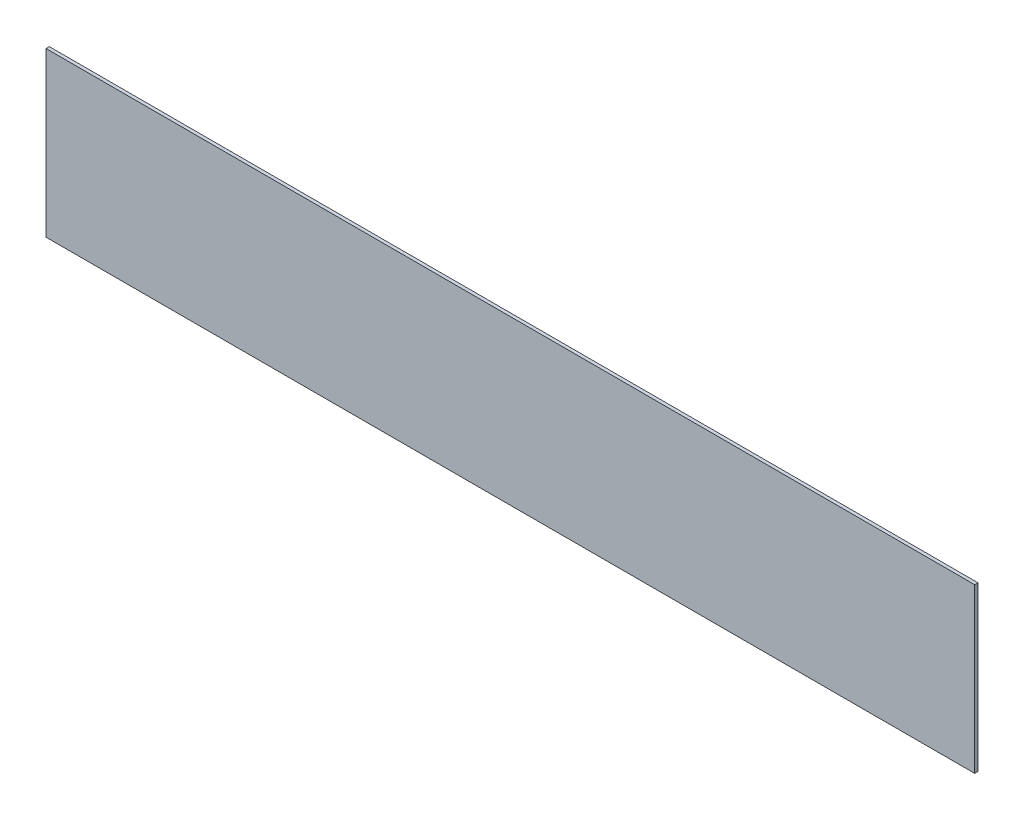
ISO-10303-21;
HEADER;
FILE_DESCRIPTION(('STEP AP214'),'2;1');
FILE_NAME('part.step','',(''),(''),'','','');
FILE_SCHEMA(('AUTOMOTIVE_DESIGN { 1 0 10303 214 1 1 1 1 }'));
ENDSEC;
DATA;
#1=APPLICATION_CONTEXT('core data for automotive mechanical design processes');
#2=APPLICATION_PROTOCOL_DEFINITION('international standard','automotive_design',2000,#1);
#3=PRODUCT_CONTEXT('',#1,'mechanical');
#4=PRODUCT('Part','Part','',(#3));
#5=PRODUCT_RELATED_PRODUCT_CATEGORY('part','',(#4));
#6=PRODUCT_DEFINITION_FORMATION('','',#4);
#7=PRODUCT_DEFINITION_CONTEXT('part definition',#1,'design');
#8=PRODUCT_DEFINITION('design','',#6,#7);
#9=PRODUCT_DEFINITION_SHAPE('','',#8);
#10=(LENGTH_UNIT() NAMED_UNIT(*) SI_UNIT(.MILLI.,.METRE.));
#11=(NAMED_UNIT(*) PLANE_ANGLE_UNIT() SI_UNIT($,.RADIAN.));
#12=(NAMED_UNIT(*) SI_UNIT($,.STERADIAN.) SOLID_ANGLE_UNIT());
#13=UNCERTAINTY_MEASURE_WITH_UNIT(LENGTH_MEASURE(1.E-05),#10,'distance_accuracy_value','');
#14=(GEOMETRIC_REPRESENTATION_CONTEXT(3) GLOBAL_UNCERTAINTY_ASSIGNED_CONTEXT((#13)) GLOBAL_UNIT_ASSIGNED_CONTEXT((#10,
#11,#12)) REPRESENTATION_CONTEXT('',''));
#15=CARTESIAN_POINT('',(0.,0.,0.));
#16=DIRECTION('',(0.,0.,1.));
#17=DIRECTION('',(1.,0.,0.));
#18=AXIS2_PLACEMENT_3D('',#15,#16,#17);
#19=CARTESIAN_POINT('',(22.200012096658,21.914673634277,1.345));
#20=DIRECTION('',(0.,0.,1.));
#21=DIRECTION('',(1.,0.,0.));
#22=AXIS2_PLACEMENT_3D('',#19,#20,#21);
#23=PLANE('',#22);
#24=DIRECTION('',(0.,1.,0.));
#25=VECTOR('',#24,1.);
#26=CARTESIAN_POINT('',(22.91034555136,21.914673634277,1.345));
#27=LINE('',#26,#25);
#28=CARTESIAN_POINT('',(22.91034555136,21.7896736342776,1.345));
#29=VERTEX_POINT('',#28);
#30=CARTESIAN_POINT('',(22.910345545896,22.039673665327,1.345));
#31=VERTEX_POINT('',#30);
#32=EDGE_CURVE('E20',#29,#31,#27,.T.);
#33=ORIENTED_EDGE('',*,*,#32,.F.);
#34=DIRECTION('',(0.999999999999999,4.371138828674E-08,0.));
#35=VECTOR('',#34,1.);
#36=CARTESIAN_POINT('',(21.489678652884,21.789673603228,1.345));
#37=LINE('',#36,#35);
#38=CARTESIAN_POINT('',(21.48967864742,21.789673603228,1.345));
#39=VERTEX_POINT('',#38);
#40=EDGE_CURVE('E55',#39,#29,#37,.T.);
#41=ORIENTED_EDGE('',*,*,#40,.F.);
#42=DIRECTION('',(4.371138828674E-08,-0.999999999999999,0.));
#43=VECTOR('',#42,1.);
#44=CARTESIAN_POINT('',(21.489678641956,22.039673603228,1.345));
#45=LINE('',#44,#43);
#46=CARTESIAN_POINT('',(21.489678641956,22.0396736342774,1.345));
#47=VERTEX_POINT('',#46);
#48=EDGE_CURVE('E58',#47,#39,#45,.T.);
#49=ORIENTED_EDGE('',*,*,#48,.F.);
#50=DIRECTION('',(-0.999999999999999,-4.371138828674E-08,0.));
#51=VECTOR('',#50,1.);
#52=CARTESIAN_POINT('',(22.910345540432,22.039673665327,1.345));
#53=LINE('',#52,#51);
#54=EDGE_CURVE('E60',#31,#47,#53,.T.);
#55=ORIENTED_EDGE('',*,*,#54,.F.);
#56=EDGE_LOOP('',(#33,#41,#49,#55));
#57=FACE_BOUND('',#56,.T.);
#58=ADVANCED_FACE('F17',(#57),#23,.F.);
#59=CARTESIAN_POINT('',(22.910345540432,22.039673665327,1.345));
#60=DIRECTION('',(-4.371138828674E-08,0.999999999999999,0.));
#61=DIRECTION('',(-0.999999999999999,-4.371138828674E-08,0.));
#62=AXIS2_PLACEMENT_3D('',#59,#60,#61);
#63=PLANE('',#62);
#64=DIRECTION('',(1.,0.,0.));
#65=VECTOR('',#64,1.);
#66=CARTESIAN_POINT('',(22.200012096658,22.039673665327,1.35));
#67=LINE('',#66,#65);
#68=CARTESIAN_POINT('',(22.910345543164,22.039673665327,1.35));
#69=VERTEX_POINT('',#68);
#70=CARTESIAN_POINT('',(21.489678641956,22.0396736187526,1.35));
#71=VERTEX_POINT('',#70);
#72=EDGE_CURVE('E83',#69,#71,#67,.F.);
#73=ORIENTED_EDGE('',*,*,#72,.F.);
#74=DIRECTION('',(0.,0.,1.));
#75=VECTOR('',#74,1.);
#76=CARTESIAN_POINT('',(22.9103455404322,22.039673665327,1.345));
#77=LINE('',#76,#75);
#78=EDGE_CURVE('E71',#31,#69,#77,.T.);
#79=ORIENTED_EDGE('',*,*,#78,.F.);
#80=ORIENTED_EDGE('',*,*,#54,.T.);
#81=DIRECTION('',(0.,0.,1.));
#82=VECTOR('',#81,1.);
#83=CARTESIAN_POINT('',(21.489678641956,22.039673603228,1.345));
#84=LINE('',#83,#82);
#85=EDGE_CURVE('E65',#71,#47,#84,.F.);
#86=ORIENTED_EDGE('',*,*,#85,.F.);
#87=EDGE_LOOP('',(#73,#79,#80,#86));
#88=FACE_BOUND('',#87,.T.);
#89=ADVANCED_FACE('F68',(#88),#63,.T.);
#90=CARTESIAN_POINT('',(21.489678641956,22.039673603228,1.345));
#91=DIRECTION('',(-0.999999999999999,-4.371138828674E-08,0.));
#92=DIRECTION('',(4.371138828674E-08,-0.999999999999999,0.));
#93=AXIS2_PLACEMENT_3D('',#90,#91,#92);
#94=PLANE('',#93);
#95=DIRECTION('',(0.,1.,0.));
#96=VECTOR('',#95,1.);
#97=CARTESIAN_POINT('',(21.489678641956,21.914673634277,1.35));
#98=LINE('',#97,#96);
#99=CARTESIAN_POINT('',(21.4896786501519,21.789673603228,1.35));
#100=VERTEX_POINT('',#99);
#101=EDGE_CURVE('E74',#71,#100,#98,.F.);
#102=ORIENTED_EDGE('',*,*,#101,.F.);
#103=ORIENTED_EDGE('',*,*,#85,.T.);
#104=ORIENTED_EDGE('',*,*,#48,.T.);
#105=DIRECTION('',(0.,0.,1.));
#106=VECTOR('',#105,1.);
#107=CARTESIAN_POINT('',(21.489678652884,21.789673603228,1.345));
#108=LINE('',#107,#106);
#109=EDGE_CURVE('E77',#100,#39,#108,.F.);
#110=ORIENTED_EDGE('',*,*,#109,.F.);
#111=EDGE_LOOP('',(#102,#103,#104,#110));
#112=FACE_BOUND('',#111,.T.);
#113=ADVANCED_FACE('F72',(#112),#94,.T.);
#114=CARTESIAN_POINT('',(21.489678652884,21.789673603228,1.345));
#115=DIRECTION('',(4.371138828674E-08,-0.999999999999999,0.));
#116=DIRECTION('',(0.999999999999999,4.371138828674E-08,0.));
#117=AXIS2_PLACEMENT_3D('',#114,#115,#116);
#118=PLANE('',#117);
#119=DIRECTION('',(1.,0.,0.));
#120=VECTOR('',#119,1.);
#121=CARTESIAN_POINT('',(22.200012096658,21.789673603228,1.35));
#122=LINE('',#121,#120);
#123=CARTESIAN_POINT('',(22.91034555136,21.7896736498024,1.35));
#124=VERTEX_POINT('',#123);
#125=EDGE_CURVE('E26',#100,#124,#122,.T.);
#126=ORIENTED_EDGE('',*,*,#125,.F.);
#127=ORIENTED_EDGE('',*,*,#109,.T.);
#128=ORIENTED_EDGE('',*,*,#40,.T.);
#129=DIRECTION('',(0.,0.,1.));
#130=VECTOR('',#129,1.);
#131=CARTESIAN_POINT('',(22.91034555136,21.789673665327,1.345));
#132=LINE('',#131,#130);
#133=EDGE_CURVE('E35',#124,#29,#132,.F.);
#134=ORIENTED_EDGE('',*,*,#133,.F.);
#135=EDGE_LOOP('',(#126,#127,#128,#134));
#136=FACE_BOUND('',#135,.T.);
#137=ADVANCED_FACE('F89',(#136),#118,.T.);
#138=CARTESIAN_POINT('',(22.91034555136,21.789673665327,1.345));
#139=DIRECTION('',(0.999999999999999,4.371138828674E-08,0.));
#140=DIRECTION('',(-4.371138828674E-08,0.999999999999999,0.));
#141=AXIS2_PLACEMENT_3D('',#138,#139,#140);
#142=PLANE('',#141);
#143=DIRECTION('',(0.,1.,0.));
#144=VECTOR('',#143,1.);
#145=CARTESIAN_POINT('',(22.91034555136,21.914673634277,1.35));
#146=LINE('',#145,#144);
#147=EDGE_CURVE('E11',#124,#69,#146,.T.);
#148=ORIENTED_EDGE('',*,*,#147,.F.);
#149=ORIENTED_EDGE('',*,*,#133,.T.);
#150=ORIENTED_EDGE('',*,*,#32,.T.);
#151=ORIENTED_EDGE('',*,*,#78,.T.);
#152=EDGE_LOOP('',(#148,#149,#150,#151));
#153=FACE_BOUND('',#152,.T.);
#154=ADVANCED_FACE('F91',(#153),#142,.T.);
#155=CARTESIAN_POINT('',(22.200012096658,21.914673634277,1.35));
#156=DIRECTION('',(0.,0.,1.));
#157=DIRECTION('',(1.,0.,0.));
#158=AXIS2_PLACEMENT_3D('',#155,#156,#157);
#159=PLANE('',#158);
#160=ORIENTED_EDGE('',*,*,#125,.T.);
#161=ORIENTED_EDGE('',*,*,#147,.T.);
#162=ORIENTED_EDGE('',*,*,#72,.T.);
#163=ORIENTED_EDGE('',*,*,#101,.T.);
#164=EDGE_LOOP('',(#160,#161,#162,#163));
#165=FACE_BOUND('',#164,.T.);
#166=ADVANCED_FACE('F88',(#165),#159,.T.);
#167=CLOSED_SHELL('',(#58,#89,#113,#137,#154,#166));
#168=MANIFOLD_SOLID_BREP('B1',#167);
#169=ADVANCED_BREP_SHAPE_REPRESENTATION('',(#18,#168),#14);
#170=SHAPE_DEFINITION_REPRESENTATION(#9,#169);
ENDSEC;
END-ISO-10303-21;
